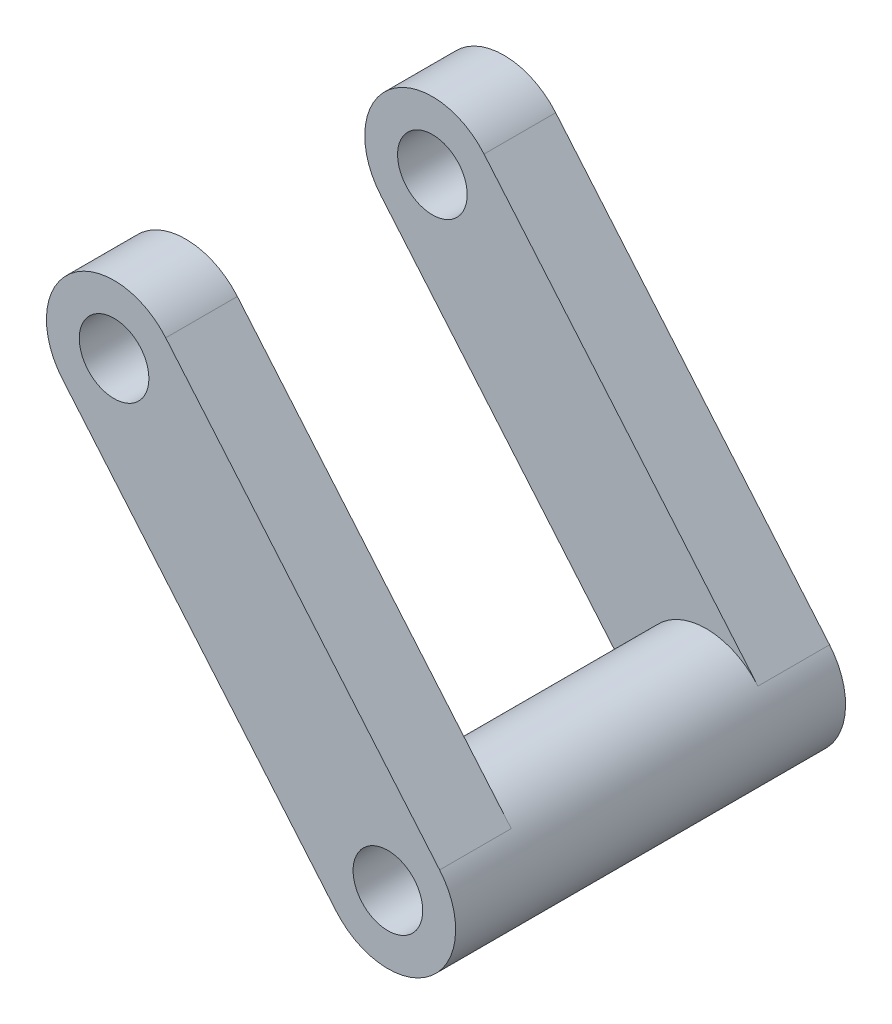
ISO-10303-21;
HEADER;
FILE_DESCRIPTION(('STEP AP214'),'2;1');
FILE_NAME('part.step','',(''),(''),'','','');
FILE_SCHEMA(('AUTOMOTIVE_DESIGN { 1 0 10303 214 1 1 1 1 }'));
ENDSEC;
DATA;
#1=APPLICATION_CONTEXT('core data for automotive mechanical design processes');
#2=APPLICATION_PROTOCOL_DEFINITION('international standard','automotive_design',2000,#1);
#3=PRODUCT_CONTEXT('',#1,'mechanical');
#4=PRODUCT('Part','Part','',(#3));
#5=PRODUCT_RELATED_PRODUCT_CATEGORY('part','',(#4));
#6=PRODUCT_DEFINITION_FORMATION('','',#4);
#7=PRODUCT_DEFINITION_CONTEXT('part definition',#1,'design');
#8=PRODUCT_DEFINITION('design','',#6,#7);
#9=PRODUCT_DEFINITION_SHAPE('','',#8);
#10=(LENGTH_UNIT() NAMED_UNIT(*) SI_UNIT(.MILLI.,.METRE.));
#11=(NAMED_UNIT(*) PLANE_ANGLE_UNIT() SI_UNIT($,.RADIAN.));
#12=(NAMED_UNIT(*) SI_UNIT($,.STERADIAN.) SOLID_ANGLE_UNIT());
#13=UNCERTAINTY_MEASURE_WITH_UNIT(LENGTH_MEASURE(1.E-05),#10,'distance_accuracy_value','');
#14=(GEOMETRIC_REPRESENTATION_CONTEXT(3) GLOBAL_UNCERTAINTY_ASSIGNED_CONTEXT((#13)) GLOBAL_UNIT_ASSIGNED_CONTEXT((#10,
#11,#12)) REPRESENTATION_CONTEXT('',''));
#15=CARTESIAN_POINT('',(0.,0.,0.));
#16=DIRECTION('',(0.,0.,1.));
#17=DIRECTION('',(1.,0.,0.));
#18=AXIS2_PLACEMENT_3D('',#15,#16,#17);
#19=CARTESIAN_POINT('',(-83.5138707810882,9.45472400746755,3.8));
#20=DIRECTION('',(0.,0.,1.));
#21=DIRECTION('',(1.,0.,0.));
#22=AXIS2_PLACEMENT_3D('',#19,#20,#21);
#23=PLANE('',#22);
#24=CARTESIAN_POINT('',(-69.7500000000002,-6.82629213483146,3.8));
#25=DIRECTION('',(0.,0.,1.));
#26=DIRECTION('',(1.,0.,0.));
#27=AXIS2_PLACEMENT_3D('',#24,#25,#26);
#28=CIRCLE('',#27,3.40408827030456);
#29=CARTESIAN_POINT('',(-67.150813208166,-4.62810083897484,3.8));
#30=VERTEX_POINT('',#29);
#31=CARTESIAN_POINT('',(-72.3500296649066,-9.02348641245665,3.8));
#32=VERTEX_POINT('',#31);
#33=EDGE_CURVE('E162',#30,#32,#28,.T.);
#34=ORIENTED_EDGE('',*,*,#33,.F.);
#35=DIRECTION('',(-0.645750380515268,0.763548587887101,0.));
#36=VECTOR('',#35,1.);
#37=CARTESIAN_POINT('',(-80.9178055822721,11.6502753012195,3.8));
#38=LINE('',#37,#36);
#39=CARTESIAN_POINT('',(-80.9178055822721,11.6502753012195,3.8));
#40=VERTEX_POINT('',#39);
#41=EDGE_CURVE('E72',#30,#40,#38,.T.);
#42=ORIENTED_EDGE('',*,*,#41,.T.);
#43=CARTESIAN_POINT('',(-83.5138707810882,9.45472400746755,3.8));
#44=DIRECTION('',(0.,0.,1.));
#45=DIRECTION('',(1.,0.,0.));
#46=AXIS2_PLACEMENT_3D('',#43,#44,#45);
#47=CIRCLE('',#46,3.4);
#48=CARTESIAN_POINT('',(-86.1107778406964,7.26016853453977,3.8));
#49=VERTEX_POINT('',#48);
#50=EDGE_CURVE('E175',#40,#49,#47,.T.);
#51=ORIENTED_EDGE('',*,*,#50,.T.);
#52=DIRECTION('',(0.645457492037583,-0.763796194002401,0.));
#53=VECTOR('',#52,1.);
#54=CARTESIAN_POINT('',(-86.1107778406964,7.26016853453977,3.8));
#55=LINE('',#54,#53);
#56=EDGE_CURVE('E98',#49,#32,#55,.T.);
#57=ORIENTED_EDGE('',*,*,#56,.T.);
#58=EDGE_LOOP('',(#34,#42,#51,#57));
#59=FACE_BOUND('',#58,.T.);
#60=CARTESIAN_POINT('',(-83.5138707810882,9.45472400746755,3.8));
#61=DIRECTION('',(0.,0.,1.));
#62=DIRECTION('',(1.,0.,0.));
#63=AXIS2_PLACEMENT_3D('',#60,#61,#62);
#64=CIRCLE('',#63,1.75);
#65=CARTESIAN_POINT('',(-81.7638707810882,9.45472400746755,3.8));
#66=VERTEX_POINT('',#65);
#67=EDGE_CURVE('E166',#66,#66,#64,.T.);
#68=ORIENTED_EDGE('',*,*,#67,.F.);
#69=EDGE_LOOP('',(#68));
#70=FACE_BOUND('',#69,.T.);
#71=ADVANCED_FACE('F48',(#59,#70),#23,.T.);
#72=CARTESIAN_POINT('',(-83.5138707810882,9.45472400746755,0.2));
#73=DIRECTION('',(0.,0.,1.));
#74=DIRECTION('',(1.,0.,0.));
#75=AXIS2_PLACEMENT_3D('',#72,#73,#74);
#76=PLANE('',#75);
#77=CARTESIAN_POINT('',(-83.5138707810882,9.45472400746755,0.2));
#78=DIRECTION('',(0.,0.,1.));
#79=DIRECTION('',(1.,0.,0.));
#80=AXIS2_PLACEMENT_3D('',#77,#78,#79);
#81=CIRCLE('',#80,3.4);
#82=CARTESIAN_POINT('',(-80.9178055822721,11.6502753012195,0.2));
#83=VERTEX_POINT('',#82);
#84=CARTESIAN_POINT('',(-86.1107778406964,7.26016853453977,0.2));
#85=VERTEX_POINT('',#84);
#86=EDGE_CURVE('E174',#83,#85,#81,.T.);
#87=ORIENTED_EDGE('',*,*,#86,.F.);
#88=DIRECTION('',(-0.645750380515268,0.763548587887101,0.));
#89=VECTOR('',#88,1.);
#90=CARTESIAN_POINT('',(-80.9178055822721,11.6502753012195,0.2));
#91=LINE('',#90,#89);
#92=CARTESIAN_POINT('',(-67.150813208166,-4.62810083897487,0.2));
#93=VERTEX_POINT('',#92);
#94=EDGE_CURVE('E93',#93,#83,#91,.T.);
#95=ORIENTED_EDGE('',*,*,#94,.F.);
#96=CARTESIAN_POINT('',(-69.75,-6.82629213483146,0.2));
#97=DIRECTION('',(0.,0.,1.));
#98=DIRECTION('',(1.,0.,0.));
#99=AXIS2_PLACEMENT_3D('',#96,#97,#98);
#100=CIRCLE('',#99,3.40408827030434);
#101=CARTESIAN_POINT('',(-72.3500296649066,-9.02348641245665,0.2));
#102=VERTEX_POINT('',#101);
#103=EDGE_CURVE('E184',#102,#93,#100,.T.);
#104=ORIENTED_EDGE('',*,*,#103,.F.);
#105=DIRECTION('',(0.645457492037583,-0.763796194002401,0.));
#106=VECTOR('',#105,1.);
#107=CARTESIAN_POINT('',(-86.1107778406964,7.26016853453977,0.2));
#108=LINE('',#107,#106);
#109=EDGE_CURVE('E182',#85,#102,#108,.T.);
#110=ORIENTED_EDGE('',*,*,#109,.F.);
#111=EDGE_LOOP('',(#87,#95,#104,#110));
#112=FACE_BOUND('',#111,.T.);
#113=CARTESIAN_POINT('',(-69.75,-6.82629213483146,0.2));
#114=DIRECTION('',(0.,0.,1.));
#115=DIRECTION('',(1.,0.,0.));
#116=AXIS2_PLACEMENT_3D('',#113,#114,#115);
#117=CIRCLE('',#116,1.75);
#118=CARTESIAN_POINT('',(-67.9999999999999,-6.82629213483146,0.2));
#119=VERTEX_POINT('',#118);
#120=EDGE_CURVE('E169',#119,#119,#117,.T.);
#121=ORIENTED_EDGE('',*,*,#120,.T.);
#122=EDGE_LOOP('',(#121));
#123=FACE_BOUND('',#122,.T.);
#124=CARTESIAN_POINT('',(-83.5138707810882,9.45472400746755,0.2));
#125=DIRECTION('',(0.,0.,1.));
#126=DIRECTION('',(1.,0.,0.));
#127=AXIS2_PLACEMENT_3D('',#124,#125,#126);
#128=CIRCLE('',#127,1.75);
#129=CARTESIAN_POINT('',(-81.7638707810882,9.45472400746755,0.2));
#130=VERTEX_POINT('',#129);
#131=EDGE_CURVE('E165',#130,#130,#128,.T.);
#132=ORIENTED_EDGE('',*,*,#131,.T.);
#133=EDGE_LOOP('',(#132));
#134=FACE_BOUND('',#133,.T.);
#135=ADVANCED_FACE('F197',(#112,#123,#134),#76,.F.);
#136=CARTESIAN_POINT('',(-83.5138707810882,9.45472400746755,3.8));
#137=DIRECTION('',(0.,0.,-1.));
#138=DIRECTION('',(-1.,0.,0.));
#139=AXIS2_PLACEMENT_3D('',#136,#137,#138);
#140=CYLINDRICAL_SURFACE('',#139,3.4);
#141=ORIENTED_EDGE('',*,*,#86,.T.);
#142=DIRECTION('',(0.,0.,-1.));
#143=VECTOR('',#142,1.);
#144=CARTESIAN_POINT('',(-86.1107778406964,7.26016853453977,3.8));
#145=LINE('',#144,#143);
#146=EDGE_CURVE('E12',#49,#85,#145,.T.);
#147=ORIENTED_EDGE('',*,*,#146,.F.);
#148=ORIENTED_EDGE('',*,*,#50,.F.);
#149=DIRECTION('',(0.,0.,-1.));
#150=VECTOR('',#149,1.);
#151=CARTESIAN_POINT('',(-80.9178055822721,11.6502753012195,3.8));
#152=LINE('',#151,#150);
#153=EDGE_CURVE('E179',#40,#83,#152,.T.);
#154=ORIENTED_EDGE('',*,*,#153,.T.);
#155=EDGE_LOOP('',(#141,#147,#148,#154));
#156=FACE_BOUND('',#155,.T.);
#157=ADVANCED_FACE('F50',(#156),#140,.T.);
#158=CARTESIAN_POINT('',(-86.1107778406964,7.26016853453977,3.8));
#159=DIRECTION('',(0.763796194002401,0.645457492037583,0.));
#160=DIRECTION('',(-0.645457492037583,0.763796194002401,0.));
#161=AXIS2_PLACEMENT_3D('',#158,#159,#160);
#162=PLANE('',#161);
#163=ORIENTED_EDGE('',*,*,#109,.T.);
#164=DIRECTION('',(0.,0.,-1.));
#165=VECTOR('',#164,1.);
#166=CARTESIAN_POINT('',(-72.3500296649066,-9.02348641245665,3.8));
#167=LINE('',#166,#165);
#168=EDGE_CURVE('E56',#32,#102,#167,.T.);
#169=ORIENTED_EDGE('',*,*,#168,.F.);
#170=ORIENTED_EDGE('',*,*,#56,.F.);
#171=ORIENTED_EDGE('',*,*,#146,.T.);
#172=EDGE_LOOP('',(#163,#169,#170,#171));
#173=FACE_BOUND('',#172,.T.);
#174=ADVANCED_FACE('F220',(#173),#162,.F.);
#175=CARTESIAN_POINT('',(-69.75,-6.82629213483146,3.8));
#176=DIRECTION('',(0.,0.,-1.));
#177=DIRECTION('',(-1.,0.,0.));
#178=AXIS2_PLACEMENT_3D('',#175,#176,#177);
#179=CYLINDRICAL_SURFACE('',#178,3.40408827030434);
#180=ORIENTED_EDGE('',*,*,#103,.T.);
#181=DIRECTION('',(0.,0.,-1.));
#182=VECTOR('',#181,1.);
#183=CARTESIAN_POINT('',(-67.150813208166,-4.62810083897487,3.8));
#184=LINE('',#183,#182);
#185=EDGE_CURVE('E188',#30,#93,#184,.T.);
#186=ORIENTED_EDGE('',*,*,#185,.F.);
#187=ORIENTED_EDGE('',*,*,#33,.T.);
#188=ORIENTED_EDGE('',*,*,#168,.T.);
#189=EDGE_LOOP('',(#180,#186,#187,#188));
#190=FACE_BOUND('',#189,.T.);
#191=CARTESIAN_POINT('',(-69.7500000000002,-6.82629213483148,16.2));
#192=DIRECTION('',(0.,0.,1.));
#193=DIRECTION('',(1.,0.,0.));
#194=AXIS2_PLACEMENT_3D('',#191,#192,#193);
#195=CIRCLE('',#194,3.40408827030456);
#196=CARTESIAN_POINT('',(-67.150813208166,-4.62810083897489,16.2));
#197=VERTEX_POINT('',#196);
#198=CARTESIAN_POINT('',(-72.3500296649067,-9.02348641245657,16.2));
#199=VERTEX_POINT('',#198);
#200=EDGE_CURVE('E63',#197,#199,#195,.T.);
#201=ORIENTED_EDGE('',*,*,#200,.F.);
#202=DIRECTION('',(0.,0.,1.));
#203=VECTOR('',#202,1.);
#204=CARTESIAN_POINT('',(-67.150813208166,-4.62810083897489,16.2));
#205=LINE('',#204,#203);
#206=CARTESIAN_POINT('',(-67.150813208166,-4.6281008389749,19.8));
#207=VERTEX_POINT('',#206);
#208=EDGE_CURVE('E133',#197,#207,#205,.T.);
#209=ORIENTED_EDGE('',*,*,#208,.T.);
#210=CARTESIAN_POINT('',(-69.75,-6.82629213483149,19.8));
#211=DIRECTION('',(0.,0.,1.));
#212=DIRECTION('',(1.,0.,0.));
#213=AXIS2_PLACEMENT_3D('',#210,#211,#212);
#214=CIRCLE('',#213,3.40408827030434);
#215=CARTESIAN_POINT('',(-72.3500296649066,-9.02348641245668,19.8));
#216=VERTEX_POINT('',#215);
#217=EDGE_CURVE('E152',#216,#207,#214,.T.);
#218=ORIENTED_EDGE('',*,*,#217,.F.);
#219=DIRECTION('',(0.,0.,1.));
#220=VECTOR('',#219,1.);
#221=CARTESIAN_POINT('',(-72.3500296649066,-9.02348641245667,16.2));
#222=LINE('',#221,#220);
#223=EDGE_CURVE('E158',#199,#216,#222,.T.);
#224=ORIENTED_EDGE('',*,*,#223,.F.);
#225=EDGE_LOOP('',(#201,#209,#218,#224));
#226=FACE_BOUND('',#225,.T.);
#227=ADVANCED_FACE('F192',(#190,#226),#179,.T.);
#228=CARTESIAN_POINT('',(-80.9178055822721,11.6502753012195,3.8));
#229=DIRECTION('',(-0.763548587887101,-0.645750380515268,0.));
#230=DIRECTION('',(0.645750380515268,-0.763548587887101,0.));
#231=AXIS2_PLACEMENT_3D('',#228,#229,#230);
#232=PLANE('',#231);
#233=ORIENTED_EDGE('',*,*,#94,.T.);
#234=ORIENTED_EDGE('',*,*,#153,.F.);
#235=ORIENTED_EDGE('',*,*,#41,.F.);
#236=ORIENTED_EDGE('',*,*,#185,.T.);
#237=EDGE_LOOP('',(#233,#234,#235,#236));
#238=FACE_BOUND('',#237,.T.);
#239=ADVANCED_FACE('F202',(#238),#232,.F.);
#240=CARTESIAN_POINT('',(-69.75,-6.82629213483146,3.8));
#241=DIRECTION('',(0.,0.,-1.));
#242=DIRECTION('',(-1.,0.,0.));
#243=AXIS2_PLACEMENT_3D('',#240,#241,#242);
#244=CYLINDRICAL_SURFACE('',#243,1.75);
#245=ORIENTED_EDGE('',*,*,#120,.F.);
#246=EDGE_LOOP('',(#245));
#247=FACE_BOUND('',#246,.T.);
#248=CARTESIAN_POINT('',(-69.75,-6.82629213483149,19.8));
#249=DIRECTION('',(0.,0.,1.));
#250=DIRECTION('',(1.,0.,0.));
#251=AXIS2_PLACEMENT_3D('',#248,#249,#250);
#252=CIRCLE('',#251,1.75);
#253=CARTESIAN_POINT('',(-68.,-6.82629213483149,19.8));
#254=VERTEX_POINT('',#253);
#255=EDGE_CURVE('E150',#254,#254,#252,.T.);
#256=ORIENTED_EDGE('',*,*,#255,.T.);
#257=EDGE_LOOP('',(#256));
#258=FACE_BOUND('',#257,.T.);
#259=ADVANCED_FACE('F211',(#247,#258),#244,.F.);
#260=CARTESIAN_POINT('',(-83.5138707810882,9.45472400746755,3.8));
#261=DIRECTION('',(0.,0.,-1.));
#262=DIRECTION('',(-1.,0.,0.));
#263=AXIS2_PLACEMENT_3D('',#260,#261,#262);
#264=CYLINDRICAL_SURFACE('',#263,1.75);
#265=ORIENTED_EDGE('',*,*,#67,.T.);
#266=EDGE_LOOP('',(#265));
#267=FACE_BOUND('',#266,.T.);
#268=ORIENTED_EDGE('',*,*,#131,.F.);
#269=EDGE_LOOP('',(#268));
#270=FACE_BOUND('',#269,.T.);
#271=ADVANCED_FACE('F208',(#267,#270),#264,.F.);
#272=CARTESIAN_POINT('',(-83.5138707810882,9.45472400746752,16.2));
#273=DIRECTION('',(0.,0.,1.));
#274=DIRECTION('',(0.,-1.,0.));
#275=AXIS2_PLACEMENT_3D('',#272,#273,#274);
#276=CYLINDRICAL_SURFACE('',#275,3.4);
#277=CARTESIAN_POINT('',(-83.5138707810882,9.45472400746751,19.8));
#278=DIRECTION('',(0.,0.,1.));
#279=DIRECTION('',(1.,0.,0.));
#280=AXIS2_PLACEMENT_3D('',#277,#278,#279);
#281=CIRCLE('',#280,3.4);
#282=CARTESIAN_POINT('',(-80.9178055822721,11.6502753012194,19.8));
#283=VERTEX_POINT('',#282);
#284=CARTESIAN_POINT('',(-86.1107778406964,7.26016853453974,19.8));
#285=VERTEX_POINT('',#284);
#286=EDGE_CURVE('E128',#283,#285,#281,.T.);
#287=ORIENTED_EDGE('',*,*,#286,.F.);
#288=DIRECTION('',(0.,0.,1.));
#289=VECTOR('',#288,1.);
#290=CARTESIAN_POINT('',(-80.9178055822721,11.6502753012194,16.2));
#291=LINE('',#290,#289);
#292=CARTESIAN_POINT('',(-80.9178055822721,11.6502753012194,16.2));
#293=VERTEX_POINT('',#292);
#294=EDGE_CURVE('E123',#293,#283,#291,.T.);
#295=ORIENTED_EDGE('',*,*,#294,.F.);
#296=CARTESIAN_POINT('',(-83.5138707810882,9.45472400746752,16.2));
#297=DIRECTION('',(0.,0.,1.));
#298=DIRECTION('',(1.,0.,0.));
#299=AXIS2_PLACEMENT_3D('',#296,#297,#298);
#300=CIRCLE('',#299,3.4);
#301=CARTESIAN_POINT('',(-86.1107778406964,7.26016853453975,16.2));
#302=VERTEX_POINT('',#301);
#303=EDGE_CURVE('E126',#293,#302,#300,.T.);
#304=ORIENTED_EDGE('',*,*,#303,.T.);
#305=DIRECTION('',(0.,0.,1.));
#306=VECTOR('',#305,1.);
#307=CARTESIAN_POINT('',(-86.1107778406964,7.26016853453975,16.2));
#308=LINE('',#307,#306);
#309=EDGE_CURVE('E144',#302,#285,#308,.T.);
#310=ORIENTED_EDGE('',*,*,#309,.T.);
#311=EDGE_LOOP('',(#287,#295,#304,#310));
#312=FACE_BOUND('',#311,.T.);
#313=ADVANCED_FACE('F125',(#312),#276,.T.);
#314=CARTESIAN_POINT('',(-80.9178055822721,11.6502753012194,16.2));
#315=DIRECTION('',(0.763548587887101,0.645750380515268,0.));
#316=DIRECTION('',(-0.645750380515268,0.763548587887101,0.));
#317=AXIS2_PLACEMENT_3D('',#314,#315,#316);
#318=PLANE('',#317);
#319=DIRECTION('',(-0.645750380515268,0.763548587887101,0.));
#320=VECTOR('',#319,1.);
#321=CARTESIAN_POINT('',(-80.9178055822721,11.6502753012194,19.8));
#322=LINE('',#321,#320);
#323=EDGE_CURVE('E149',#207,#283,#322,.T.);
#324=ORIENTED_EDGE('',*,*,#323,.F.);
#325=ORIENTED_EDGE('',*,*,#208,.F.);
#326=DIRECTION('',(-0.645750380515268,0.763548587887101,0.));
#327=VECTOR('',#326,1.);
#328=CARTESIAN_POINT('',(-80.9178055822721,11.6502753012194,16.2));
#329=LINE('',#328,#327);
#330=EDGE_CURVE('E136',#197,#293,#329,.T.);
#331=ORIENTED_EDGE('',*,*,#330,.T.);
#332=ORIENTED_EDGE('',*,*,#294,.T.);
#333=EDGE_LOOP('',(#324,#325,#331,#332));
#334=FACE_BOUND('',#333,.T.);
#335=ADVANCED_FACE('F142',(#334),#318,.T.);
#336=CARTESIAN_POINT('',(-86.1107778406964,7.26016853453975,16.2));
#337=DIRECTION('',(-0.763796194002401,-0.645457492037583,0.));
#338=DIRECTION('',(0.645457492037583,-0.763796194002401,0.));
#339=AXIS2_PLACEMENT_3D('',#336,#337,#338);
#340=PLANE('',#339);
#341=DIRECTION('',(0.645457492037583,-0.763796194002401,0.));
#342=VECTOR('',#341,1.);
#343=CARTESIAN_POINT('',(-86.1107778406964,7.26016853453974,19.8));
#344=LINE('',#343,#342);
#345=EDGE_CURVE('E139',#285,#216,#344,.T.);
#346=ORIENTED_EDGE('',*,*,#345,.F.);
#347=ORIENTED_EDGE('',*,*,#309,.F.);
#348=DIRECTION('',(0.645457492037583,-0.763796194002401,0.));
#349=VECTOR('',#348,1.);
#350=CARTESIAN_POINT('',(-86.1107778406964,7.26016853453975,16.2));
#351=LINE('',#350,#349);
#352=EDGE_CURVE('E138',#302,#199,#351,.T.);
#353=ORIENTED_EDGE('',*,*,#352,.T.);
#354=ORIENTED_EDGE('',*,*,#223,.T.);
#355=EDGE_LOOP('',(#346,#347,#353,#354));
#356=FACE_BOUND('',#355,.T.);
#357=ADVANCED_FACE('F262',(#356),#340,.T.);
#358=CARTESIAN_POINT('',(-83.5138707810882,9.45472400746752,16.2));
#359=DIRECTION('',(0.,0.,-1.));
#360=DIRECTION('',(1.,0.,0.));
#361=AXIS2_PLACEMENT_3D('',#358,#359,#360);
#362=PLANE('',#361);
#363=CARTESIAN_POINT('',(-83.5138707810882,9.45472400746752,16.2));
#364=DIRECTION('',(0.,0.,1.));
#365=DIRECTION('',(1.,0.,0.));
#366=AXIS2_PLACEMENT_3D('',#363,#364,#365);
#367=CIRCLE('',#366,1.75);
#368=CARTESIAN_POINT('',(-81.7638707810882,9.45472400746752,16.2));
#369=VERTEX_POINT('',#368);
#370=EDGE_CURVE('E357',#369,#369,#367,.T.);
#371=ORIENTED_EDGE('',*,*,#370,.T.);
#372=EDGE_LOOP('',(#371));
#373=FACE_BOUND('',#372,.T.);
#374=ORIENTED_EDGE('',*,*,#330,.F.);
#375=ORIENTED_EDGE('',*,*,#200,.T.);
#376=ORIENTED_EDGE('',*,*,#352,.F.);
#377=ORIENTED_EDGE('',*,*,#303,.F.);
#378=EDGE_LOOP('',(#374,#375,#376,#377));
#379=FACE_BOUND('',#378,.T.);
#380=ADVANCED_FACE('F135',(#373,#379),#362,.T.);
#381=CARTESIAN_POINT('',(-83.5138707810882,9.45472400746751,19.8));
#382=DIRECTION('',(0.,0.,-1.));
#383=DIRECTION('',(1.,0.,0.));
#384=AXIS2_PLACEMENT_3D('',#381,#382,#383);
#385=PLANE('',#384);
#386=CARTESIAN_POINT('',(-83.5138707810882,9.45472400746751,19.8));
#387=DIRECTION('',(0.,0.,1.));
#388=DIRECTION('',(1.,0.,0.));
#389=AXIS2_PLACEMENT_3D('',#386,#387,#388);
#390=CIRCLE('',#389,1.75);
#391=CARTESIAN_POINT('',(-81.7638707810882,9.45472400746751,19.8));
#392=VERTEX_POINT('',#391);
#393=EDGE_CURVE('E360',#392,#392,#390,.T.);
#394=ORIENTED_EDGE('',*,*,#393,.F.);
#395=EDGE_LOOP('',(#394));
#396=FACE_BOUND('',#395,.T.);
#397=ORIENTED_EDGE('',*,*,#255,.F.);
#398=EDGE_LOOP('',(#397));
#399=FACE_BOUND('',#398,.T.);
#400=ORIENTED_EDGE('',*,*,#286,.T.);
#401=ORIENTED_EDGE('',*,*,#345,.T.);
#402=ORIENTED_EDGE('',*,*,#217,.T.);
#403=ORIENTED_EDGE('',*,*,#323,.T.);
#404=EDGE_LOOP('',(#400,#401,#402,#403));
#405=FACE_BOUND('',#404,.T.);
#406=ADVANCED_FACE('F276',(#396,#399,#405),#385,.F.);
#407=CARTESIAN_POINT('',(-83.5138707810882,9.45472400746752,16.2));
#408=DIRECTION('',(0.,0.,1.));
#409=DIRECTION('',(0.,-1.,0.));
#410=AXIS2_PLACEMENT_3D('',#407,#408,#409);
#411=CYLINDRICAL_SURFACE('',#410,1.75);
#412=ORIENTED_EDGE('',*,*,#370,.F.);
#413=EDGE_LOOP('',(#412));
#414=FACE_BOUND('',#413,.T.);
#415=ORIENTED_EDGE('',*,*,#393,.T.);
#416=EDGE_LOOP('',(#415));
#417=FACE_BOUND('',#416,.T.);
#418=ADVANCED_FACE('F284',(#414,#417),#411,.F.);
#419=CLOSED_SHELL('',(#71,#135,#157,#174,#227,#239,#259,#271,#313,#335,#357,#380,#406,#418));
#420=MANIFOLD_SOLID_BREP('B2',#419);
#421=ADVANCED_BREP_SHAPE_REPRESENTATION('',(#18,#420),#14);
#422=SHAPE_DEFINITION_REPRESENTATION(#9,#421);
ENDSEC;
END-ISO-10303-21;
